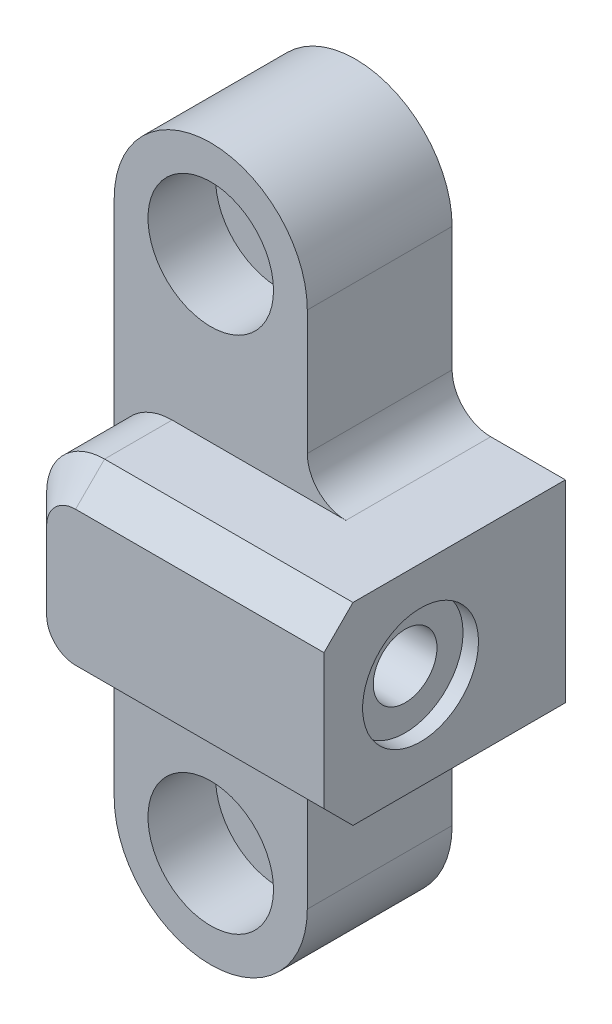
ISO-10303-21;
HEADER;
FILE_DESCRIPTION(('STEP AP214'),'2;1');
FILE_NAME('part.step','',(''),(''),'','','');
FILE_SCHEMA(('AUTOMOTIVE_DESIGN { 1 0 10303 214 1 1 1 1 }'));
ENDSEC;
DATA;
#1=APPLICATION_CONTEXT('core data for automotive mechanical design processes');
#2=APPLICATION_PROTOCOL_DEFINITION('international standard','automotive_design',2000,#1);
#3=PRODUCT_CONTEXT('',#1,'mechanical');
#4=PRODUCT('Part','Part','',(#3));
#5=PRODUCT_RELATED_PRODUCT_CATEGORY('part','',(#4));
#6=PRODUCT_DEFINITION_FORMATION('','',#4);
#7=PRODUCT_DEFINITION_CONTEXT('part definition',#1,'design');
#8=PRODUCT_DEFINITION('design','',#6,#7);
#9=PRODUCT_DEFINITION_SHAPE('','',#8);
#10=(LENGTH_UNIT() NAMED_UNIT(*) SI_UNIT(.MILLI.,.METRE.));
#11=(NAMED_UNIT(*) PLANE_ANGLE_UNIT() SI_UNIT($,.RADIAN.));
#12=(NAMED_UNIT(*) SI_UNIT($,.STERADIAN.) SOLID_ANGLE_UNIT());
#13=UNCERTAINTY_MEASURE_WITH_UNIT(LENGTH_MEASURE(1.E-05),#10,'distance_accuracy_value','');
#14=(GEOMETRIC_REPRESENTATION_CONTEXT(3) GLOBAL_UNCERTAINTY_ASSIGNED_CONTEXT((#13)) GLOBAL_UNIT_ASSIGNED_CONTEXT((#10,
#11,#12)) REPRESENTATION_CONTEXT('',''));
#15=CARTESIAN_POINT('',(0.,0.,0.));
#16=DIRECTION('',(0.,0.,1.));
#17=DIRECTION('',(1.,0.,0.));
#18=AXIS2_PLACEMENT_3D('',#15,#16,#17);
#19=CARTESIAN_POINT('',(24.300000000001,-5.,12.5));
#20=DIRECTION('',(1.,0.,0.));
#21=DIRECTION('',(0.,0.,-1.));
#22=AXIS2_PLACEMENT_3D('',#19,#20,#21);
#23=PLANE('',#22);
#24=CARTESIAN_POINT('',(24.300000000001,0.,7.5));
#25=DIRECTION('',(1.,0.,0.));
#26=DIRECTION('',(0.,0.,-1.));
#27=AXIS2_PLACEMENT_3D('',#24,#25,#26);
#28=CIRCLE('',#27,3.);
#29=CARTESIAN_POINT('',(24.300000000001,0.,4.5));
#30=VERTEX_POINT('',#29);
#31=EDGE_CURVE('E696',#30,#30,#28,.T.);
#32=ORIENTED_EDGE('',*,*,#31,.F.);
#33=EDGE_LOOP('',(#32));
#34=FACE_BOUND('',#33,.T.);
#35=DIRECTION('',(0.,0.,-1.));
#36=VECTOR('',#35,1.);
#37=CARTESIAN_POINT('',(24.300000000001,5.,12.5));
#38=LINE('',#37,#36);
#39=CARTESIAN_POINT('',(24.300000000001,5.,11.));
#40=VERTEX_POINT('',#39);
#41=CARTESIAN_POINT('',(24.300000000001,5.,0.));
#42=VERTEX_POINT('',#41);
#43=EDGE_CURVE('E220',#40,#42,#38,.T.);
#44=ORIENTED_EDGE('',*,*,#43,.F.);
#45=DIRECTION('',(0.,0.707106781186544,-0.707106781186551));
#46=VECTOR('',#45,1.);
#47=CARTESIAN_POINT('',(24.300000000001,-0.749999999999962,16.75));
#48=LINE('',#47,#46);
#49=CARTESIAN_POINT('',(24.300000000001,3.5,12.5));
#50=VERTEX_POINT('',#49);
#51=EDGE_CURVE('E259',#40,#50,#48,.F.);
#52=ORIENTED_EDGE('',*,*,#51,.T.);
#53=DIRECTION('',(0.,1.,0.));
#54=VECTOR('',#53,1.);
#55=CARTESIAN_POINT('',(24.300000000001,-5.,12.5));
#56=LINE('',#55,#54);
#57=CARTESIAN_POINT('',(24.300000000001,-3.50000000000001,12.5));
#58=VERTEX_POINT('',#57);
#59=EDGE_CURVE('E232',#58,#50,#56,.T.);
#60=ORIENTED_EDGE('',*,*,#59,.F.);
#61=DIRECTION('',(0.,-0.707106781186544,-0.707106781186551));
#62=VECTOR('',#61,1.);
#63=CARTESIAN_POINT('',(24.300000000001,-4.25,11.75));
#64=LINE('',#63,#62);
#65=CARTESIAN_POINT('',(24.300000000001,-5.,11.));
#66=VERTEX_POINT('',#65);
#67=EDGE_CURVE('E257',#58,#66,#64,.T.);
#68=ORIENTED_EDGE('',*,*,#67,.T.);
#69=DIRECTION('',(0.,0.,-1.));
#70=VECTOR('',#69,1.);
#71=CARTESIAN_POINT('',(24.300000000001,-5.,12.5));
#72=LINE('',#71,#70);
#73=CARTESIAN_POINT('',(24.300000000001,-5.,0.));
#74=VERTEX_POINT('',#73);
#75=EDGE_CURVE('E223',#66,#74,#72,.T.);
#76=ORIENTED_EDGE('',*,*,#75,.T.);
#77=DIRECTION('',(0.,1.,0.));
#78=VECTOR('',#77,1.);
#79=CARTESIAN_POINT('',(24.300000000001,-5.,0.));
#80=LINE('',#79,#78);
#81=EDGE_CURVE('E228',#74,#42,#80,.T.);
#82=ORIENTED_EDGE('',*,*,#81,.T.);
#83=EDGE_LOOP('',(#44,#52,#60,#68,#76,#82));
#84=FACE_BOUND('',#83,.T.);
#85=ADVANCED_FACE('F43',(#34,#84),#23,.T.);
#86=CARTESIAN_POINT('',(8.4350288425443,-5.,12.5));
#87=DIRECTION('',(0.,0.,1.));
#88=DIRECTION('',(1.,0.,0.));
#89=AXIS2_PLACEMENT_3D('',#86,#87,#88);
#90=PLANE('',#89);
#91=ORIENTED_EDGE('',*,*,#59,.T.);
#92=DIRECTION('',(-1.,0.,0.));
#93=VECTOR('',#92,1.);
#94=CARTESIAN_POINT('',(8.4350288425443,3.5,12.5));
#95=LINE('',#94,#93);
#96=CARTESIAN_POINT('',(11.4350288425443,3.5,12.5));
#97=VERTEX_POINT('',#96);
#98=EDGE_CURVE('E269',#50,#97,#95,.T.);
#99=ORIENTED_EDGE('',*,*,#98,.T.);
#100=CARTESIAN_POINT('',(11.4350288425443,2.,12.5));
#101=DIRECTION('',(0.,0.,1.));
#102=DIRECTION('',(1.,0.,0.));
#103=AXIS2_PLACEMENT_3D('',#100,#101,#102);
#104=CIRCLE('',#103,1.5);
#105=CARTESIAN_POINT('',(9.9350288425443,2.,12.5));
#106=VERTEX_POINT('',#105);
#107=EDGE_CURVE('E267',#97,#106,#104,.T.);
#108=ORIENTED_EDGE('',*,*,#107,.T.);
#109=DIRECTION('',(0.,-1.,0.));
#110=VECTOR('',#109,1.);
#111=CARTESIAN_POINT('',(9.9350288425443,-5.,12.5));
#112=LINE('',#111,#110);
#113=CARTESIAN_POINT('',(9.9350288425443,-2.,12.5));
#114=VERTEX_POINT('',#113);
#115=EDGE_CURVE('E265',#106,#114,#112,.T.);
#116=ORIENTED_EDGE('',*,*,#115,.T.);
#117=CARTESIAN_POINT('',(11.4350288425443,-2.,12.5));
#118=DIRECTION('',(0.,0.,1.));
#119=DIRECTION('',(1.,0.,0.));
#120=AXIS2_PLACEMENT_3D('',#117,#118,#119);
#121=CIRCLE('',#120,1.5);
#122=CARTESIAN_POINT('',(11.4350288425443,-3.50000000000001,12.5));
#123=VERTEX_POINT('',#122);
#124=EDGE_CURVE('E263',#114,#123,#121,.T.);
#125=ORIENTED_EDGE('',*,*,#124,.T.);
#126=DIRECTION('',(1.,0.,0.));
#127=VECTOR('',#126,1.);
#128=CARTESIAN_POINT('',(24.300000000001,-3.50000000000001,12.5));
#129=LINE('',#128,#127);
#130=EDGE_CURVE('E261',#123,#58,#129,.T.);
#131=ORIENTED_EDGE('',*,*,#130,.T.);
#132=EDGE_LOOP('',(#91,#99,#108,#116,#125,#131));
#133=FACE_BOUND('',#132,.T.);
#134=ADVANCED_FACE('F366',(#133),#90,.T.);
#135=CARTESIAN_POINT('',(8.4350288425443,-5.,0.));
#136=DIRECTION('',(-1.,0.,0.));
#137=DIRECTION('',(0.,0.,1.));
#138=AXIS2_PLACEMENT_3D('',#135,#136,#137);
#139=PLANE('',#138);
#140=DIRECTION('',(0.,0.,1.));
#141=VECTOR('',#140,1.);
#142=CARTESIAN_POINT('',(8.4350288425443,-2.,12.5));
#143=LINE('',#142,#141);
#144=CARTESIAN_POINT('',(8.4350288425443,-2.,7.5));
#145=VERTEX_POINT('',#144);
#146=CARTESIAN_POINT('',(8.4350288425443,-2.,11.));
#147=VERTEX_POINT('',#146);
#148=EDGE_CURVE('E241',#145,#147,#143,.T.);
#149=ORIENTED_EDGE('',*,*,#148,.T.);
#150=DIRECTION('',(0.,1.,0.));
#151=VECTOR('',#150,1.);
#152=CARTESIAN_POINT('',(8.4350288425443,-5.,11.));
#153=LINE('',#152,#151);
#154=CARTESIAN_POINT('',(8.4350288425443,2.,11.));
#155=VERTEX_POINT('',#154);
#156=EDGE_CURVE('E273',#147,#155,#153,.T.);
#157=ORIENTED_EDGE('',*,*,#156,.T.);
#158=DIRECTION('',(0.,0.,1.));
#159=VECTOR('',#158,1.);
#160=CARTESIAN_POINT('',(8.4350288425443,2.,0.));
#161=LINE('',#160,#159);
#162=CARTESIAN_POINT('',(8.4350288425443,2.,7.5));
#163=VERTEX_POINT('',#162);
#164=EDGE_CURVE('E235',#155,#163,#161,.F.);
#165=ORIENTED_EDGE('',*,*,#164,.T.);
#166=DIRECTION('',(0.,1.,0.));
#167=VECTOR('',#166,1.);
#168=CARTESIAN_POINT('',(8.4350288425443,5.,7.5));
#169=LINE('',#168,#167);
#170=CARTESIAN_POINT('',(8.4350288425443,13.4350288425445,7.5));
#171=VERTEX_POINT('',#170);
#172=EDGE_CURVE('E186',#163,#171,#169,.T.);
#173=ORIENTED_EDGE('',*,*,#172,.T.);
#174=DIRECTION('',(0.,0.,-1.));
#175=VECTOR('',#174,1.);
#176=CARTESIAN_POINT('',(8.4350288425443,13.4350288425445,7.5));
#177=LINE('',#176,#175);
#178=CARTESIAN_POINT('',(8.4350288425443,13.4350288425445,0.));
#179=VERTEX_POINT('',#178);
#180=EDGE_CURVE('E194',#171,#179,#177,.T.);
#181=ORIENTED_EDGE('',*,*,#180,.T.);
#182=DIRECTION('',(0.,1.,0.));
#183=VECTOR('',#182,1.);
#184=CARTESIAN_POINT('',(8.4350288425443,-5.,0.));
#185=LINE('',#184,#183);
#186=CARTESIAN_POINT('',(8.4350288425441,-13.4350288425443,0.));
#187=VERTEX_POINT('',#186);
#188=EDGE_CURVE('E236',#187,#179,#185,.T.);
#189=ORIENTED_EDGE('',*,*,#188,.F.);
#190=DIRECTION('',(0.,0.,-1.));
#191=VECTOR('',#190,1.);
#192=CARTESIAN_POINT('',(8.4350288425441,-13.4350288425443,7.5));
#193=LINE('',#192,#191);
#194=CARTESIAN_POINT('',(8.4350288425441,-13.4350288425443,7.5));
#195=VERTEX_POINT('',#194);
#196=EDGE_CURVE('E217',#195,#187,#193,.T.);
#197=ORIENTED_EDGE('',*,*,#196,.F.);
#198=DIRECTION('',(0.,1.,0.));
#199=VECTOR('',#198,1.);
#200=CARTESIAN_POINT('',(8.4350288425443,-13.4350288425443,7.5));
#201=LINE('',#200,#199);
#202=EDGE_CURVE('E203',#195,#145,#201,.T.);
#203=ORIENTED_EDGE('',*,*,#202,.T.);
#204=EDGE_LOOP('',(#149,#157,#165,#173,#181,#189,#197,#203));
#205=FACE_BOUND('',#204,.T.);
#206=ADVANCED_FACE('F345',(#205),#139,.T.);
#207=CARTESIAN_POINT('',(24.300000000001,-5.,0.));
#208=DIRECTION('',(0.,0.,-1.));
#209=DIRECTION('',(-1.,0.,0.));
#210=AXIS2_PLACEMENT_3D('',#207,#208,#209);
#211=PLANE('',#210);
#212=CARTESIAN_POINT('',(13.4350288425443,13.4350288425445,0.));
#213=DIRECTION('',(0.,0.,1.));
#214=DIRECTION('',(1.,0.,0.));
#215=AXIS2_PLACEMENT_3D('',#212,#213,#214);
#216=CIRCLE('',#215,1.70000000000001);
#217=CARTESIAN_POINT('',(15.1350288425443,13.4350288425445,0.));
#218=VERTEX_POINT('',#217);
#219=EDGE_CURVE('E681',#218,#218,#216,.T.);
#220=ORIENTED_EDGE('',*,*,#219,.T.);
#221=EDGE_LOOP('',(#220));
#222=FACE_BOUND('',#221,.T.);
#223=CARTESIAN_POINT('',(13.4350288425445,-13.4350288425443,0.));
#224=DIRECTION('',(0.,0.,1.));
#225=DIRECTION('',(1.,0.,0.));
#226=AXIS2_PLACEMENT_3D('',#223,#224,#225);
#227=CIRCLE('',#226,1.70000000000001);
#228=CARTESIAN_POINT('',(15.1350288425445,-13.4350288425443,0.));
#229=VERTEX_POINT('',#228);
#230=EDGE_CURVE('E693',#229,#229,#227,.T.);
#231=ORIENTED_EDGE('',*,*,#230,.T.);
#232=EDGE_LOOP('',(#231));
#233=FACE_BOUND('',#232,.T.);
#234=DIRECTION('',(-1.,0.,0.));
#235=VECTOR('',#234,1.);
#236=CARTESIAN_POINT('',(24.300000000001,5.,0.));
#237=LINE('',#236,#235);
#238=CARTESIAN_POINT('',(20.4350288425443,5.,0.));
#239=VERTEX_POINT('',#238);
#240=EDGE_CURVE('E226',#42,#239,#237,.T.);
#241=ORIENTED_EDGE('',*,*,#240,.F.);
#242=ORIENTED_EDGE('',*,*,#81,.F.);
#243=DIRECTION('',(-1.,0.,0.));
#244=VECTOR('',#243,1.);
#245=CARTESIAN_POINT('',(24.300000000001,-5.,0.));
#246=LINE('',#245,#244);
#247=CARTESIAN_POINT('',(20.4350288425443,-5.,0.));
#248=VERTEX_POINT('',#247);
#249=EDGE_CURVE('E225',#74,#248,#246,.T.);
#250=ORIENTED_EDGE('',*,*,#249,.T.);
#251=CARTESIAN_POINT('',(20.4350288425443,-7.,0.));
#252=DIRECTION('',(0.,0.,-1.));
#253=DIRECTION('',(-1.,0.,0.));
#254=AXIS2_PLACEMENT_3D('',#251,#252,#253);
#255=CIRCLE('',#254,2.);
#256=CARTESIAN_POINT('',(18.4350288425443,-7.00000000000005,0.));
#257=VERTEX_POINT('',#256);
#258=EDGE_CURVE('E51',#248,#257,#255,.F.);
#259=ORIENTED_EDGE('',*,*,#258,.T.);
#260=DIRECTION('',(0.,-1.,0.));
#261=VECTOR('',#260,1.);
#262=CARTESIAN_POINT('',(18.4350288425443,-5.,0.));
#263=LINE('',#262,#261);
#264=CARTESIAN_POINT('',(18.4350288425445,-13.4350288425443,0.));
#265=VERTEX_POINT('',#264);
#266=EDGE_CURVE('E200',#257,#265,#263,.T.);
#267=ORIENTED_EDGE('',*,*,#266,.T.);
#268=CARTESIAN_POINT('',(13.4350288425442,-13.4350288425443,0.));
#269=DIRECTION('',(0.,0.,-1.));
#270=DIRECTION('',(-1.,0.,0.));
#271=AXIS2_PLACEMENT_3D('',#268,#269,#270);
#272=CIRCLE('',#271,5.0000000000001);
#273=EDGE_CURVE('E206',#265,#187,#272,.T.);
#274=ORIENTED_EDGE('',*,*,#273,.T.);
#275=ORIENTED_EDGE('',*,*,#188,.T.);
#276=CARTESIAN_POINT('',(13.4350288425443,13.4350288425445,0.));
#277=DIRECTION('',(0.,0.,-1.));
#278=DIRECTION('',(-1.,0.,0.));
#279=AXIS2_PLACEMENT_3D('',#276,#277,#278);
#280=CIRCLE('',#279,5.);
#281=CARTESIAN_POINT('',(18.4350288425443,13.4350288425445,0.));
#282=VERTEX_POINT('',#281);
#283=EDGE_CURVE('E172',#179,#282,#280,.T.);
#284=ORIENTED_EDGE('',*,*,#283,.T.);
#285=DIRECTION('',(0.,-1.,0.));
#286=VECTOR('',#285,1.);
#287=CARTESIAN_POINT('',(18.4350288425443,13.4350288425445,0.));
#288=LINE('',#287,#286);
#289=CARTESIAN_POINT('',(18.4350288425443,7.,0.));
#290=VERTEX_POINT('',#289);
#291=EDGE_CURVE('E176',#282,#290,#288,.T.);
#292=ORIENTED_EDGE('',*,*,#291,.T.);
#293=CARTESIAN_POINT('',(20.4350288425443,7.,0.));
#294=DIRECTION('',(0.,0.,-1.));
#295=DIRECTION('',(-1.,0.,0.));
#296=AXIS2_PLACEMENT_3D('',#293,#294,#295);
#297=CIRCLE('',#296,2.);
#298=EDGE_CURVE('E302',#290,#239,#297,.F.);
#299=ORIENTED_EDGE('',*,*,#298,.T.);
#300=EDGE_LOOP('',(#241,#242,#250,#259,#267,#274,#275,#284,#292,#299));
#301=FACE_BOUND('',#300,.T.);
#302=ADVANCED_FACE('F317',(#222,#233,#301),#211,.T.);
#303=CARTESIAN_POINT('',(0.,-5.,0.));
#304=DIRECTION('',(0.,1.,0.));
#305=DIRECTION('',(0.,0.,1.));
#306=AXIS2_PLACEMENT_3D('',#303,#304,#305);
#307=PLANE('',#306);
#308=DIRECTION('',(1.,0.,0.));
#309=VECTOR('',#308,1.);
#310=CARTESIAN_POINT('',(8.4350288425443,-5.,7.5));
#311=LINE('',#310,#309);
#312=CARTESIAN_POINT('',(11.4350288425443,-5.,7.5));
#313=VERTEX_POINT('',#312);
#314=CARTESIAN_POINT('',(20.4350288425443,-5.,7.5));
#315=VERTEX_POINT('',#314);
#316=EDGE_CURVE('E205',#313,#315,#311,.T.);
#317=ORIENTED_EDGE('',*,*,#316,.T.);
#318=DIRECTION('',(0.,0.,-1.));
#319=VECTOR('',#318,1.);
#320=CARTESIAN_POINT('',(20.4350288425443,-5.,0.));
#321=LINE('',#320,#319);
#322=EDGE_CURVE('E298',#315,#248,#321,.T.);
#323=ORIENTED_EDGE('',*,*,#322,.T.);
#324=ORIENTED_EDGE('',*,*,#249,.F.);
#325=ORIENTED_EDGE('',*,*,#75,.F.);
#326=DIRECTION('',(-1.,0.,0.));
#327=VECTOR('',#326,1.);
#328=CARTESIAN_POINT('',(11.4350288425443,-5.,11.));
#329=LINE('',#328,#327);
#330=CARTESIAN_POINT('',(11.4350288425443,-5.,11.));
#331=VERTEX_POINT('',#330);
#332=EDGE_CURVE('E277',#66,#331,#329,.T.);
#333=ORIENTED_EDGE('',*,*,#332,.T.);
#334=DIRECTION('',(0.,0.,1.));
#335=VECTOR('',#334,1.);
#336=CARTESIAN_POINT('',(11.4350288425443,-5.,7.5));
#337=LINE('',#336,#335);
#338=EDGE_CURVE('E244',#331,#313,#337,.F.);
#339=ORIENTED_EDGE('',*,*,#338,.T.);
#340=EDGE_LOOP('',(#317,#323,#324,#325,#333,#339));
#341=FACE_BOUND('',#340,.T.);
#342=ADVANCED_FACE('F327',(#341),#307,.F.);
#343=CARTESIAN_POINT('',(0.,5.,0.));
#344=DIRECTION('',(0.,1.,0.));
#345=DIRECTION('',(0.,0.,1.));
#346=AXIS2_PLACEMENT_3D('',#343,#344,#345);
#347=PLANE('',#346);
#348=ORIENTED_EDGE('',*,*,#240,.T.);
#349=DIRECTION('',(0.,0.,-1.));
#350=VECTOR('',#349,1.);
#351=CARTESIAN_POINT('',(20.4350288425443,5.,7.5));
#352=LINE('',#351,#350);
#353=CARTESIAN_POINT('',(20.4350288425443,5.,7.5));
#354=VERTEX_POINT('',#353);
#355=EDGE_CURVE('E295',#239,#354,#352,.F.);
#356=ORIENTED_EDGE('',*,*,#355,.T.);
#357=DIRECTION('',(-1.,0.,0.));
#358=VECTOR('',#357,1.);
#359=CARTESIAN_POINT('',(18.4350288425443,5.,7.5));
#360=LINE('',#359,#358);
#361=CARTESIAN_POINT('',(11.4350288425443,5.,7.5));
#362=VERTEX_POINT('',#361);
#363=EDGE_CURVE('E183',#354,#362,#360,.T.);
#364=ORIENTED_EDGE('',*,*,#363,.T.);
#365=DIRECTION('',(0.,0.,1.));
#366=VECTOR('',#365,1.);
#367=CARTESIAN_POINT('',(11.4350288425443,5.,0.));
#368=LINE('',#367,#366);
#369=CARTESIAN_POINT('',(11.4350288425443,5.,11.));
#370=VERTEX_POINT('',#369);
#371=EDGE_CURVE('E246',#362,#370,#368,.T.);
#372=ORIENTED_EDGE('',*,*,#371,.T.);
#373=DIRECTION('',(1.,0.,0.));
#374=VECTOR('',#373,1.);
#375=CARTESIAN_POINT('',(0.,5.,11.));
#376=LINE('',#375,#374);
#377=EDGE_CURVE('E254',#370,#40,#376,.T.);
#378=ORIENTED_EDGE('',*,*,#377,.T.);
#379=ORIENTED_EDGE('',*,*,#43,.T.);
#380=EDGE_LOOP('',(#348,#356,#364,#372,#378,#379));
#381=FACE_BOUND('',#380,.T.);
#382=ADVANCED_FACE('F320',(#381),#347,.T.);
#383=CARTESIAN_POINT('',(13.4350288425442,-13.4350288425443,7.5));
#384=DIRECTION('',(0.,0.,-1.));
#385=DIRECTION('',(-1.,0.,0.));
#386=AXIS2_PLACEMENT_3D('',#383,#384,#385);
#387=CYLINDRICAL_SURFACE('',#386,5.0000000000001);
#388=ORIENTED_EDGE('',*,*,#273,.F.);
#389=DIRECTION('',(0.,0.,-1.));
#390=VECTOR('',#389,1.);
#391=CARTESIAN_POINT('',(18.4350288425445,-13.4350288425443,7.5));
#392=LINE('',#391,#390);
#393=CARTESIAN_POINT('',(18.4350288425445,-13.4350288425443,7.5));
#394=VERTEX_POINT('',#393);
#395=EDGE_CURVE('E213',#394,#265,#392,.T.);
#396=ORIENTED_EDGE('',*,*,#395,.F.);
#397=CARTESIAN_POINT('',(13.4350288425442,-13.4350288425443,7.5));
#398=DIRECTION('',(0.,0.,-1.));
#399=DIRECTION('',(-1.,0.,0.));
#400=AXIS2_PLACEMENT_3D('',#397,#398,#399);
#401=CIRCLE('',#400,5.0000000000001);
#402=EDGE_CURVE('E210',#394,#195,#401,.T.);
#403=ORIENTED_EDGE('',*,*,#402,.T.);
#404=ORIENTED_EDGE('',*,*,#196,.T.);
#405=EDGE_LOOP('',(#388,#396,#403,#404));
#406=FACE_BOUND('',#405,.T.);
#407=ADVANCED_FACE('F342',(#406),#387,.T.);
#408=CARTESIAN_POINT('',(18.4350288425443,-5.,7.5));
#409=DIRECTION('',(1.,0.,0.));
#410=DIRECTION('',(0.,1.,0.));
#411=AXIS2_PLACEMENT_3D('',#408,#409,#410);
#412=PLANE('',#411);
#413=ORIENTED_EDGE('',*,*,#266,.F.);
#414=DIRECTION('',(0.,0.,-1.));
#415=VECTOR('',#414,1.);
#416=CARTESIAN_POINT('',(18.4350288425443,-7.00000000000005,7.5));
#417=LINE('',#416,#415);
#418=CARTESIAN_POINT('',(18.4350288425443,-7.00000000000005,7.5));
#419=VERTEX_POINT('',#418);
#420=EDGE_CURVE('E58',#257,#419,#417,.F.);
#421=ORIENTED_EDGE('',*,*,#420,.T.);
#422=DIRECTION('',(0.,-1.,0.));
#423=VECTOR('',#422,1.);
#424=CARTESIAN_POINT('',(18.4350288425443,-5.,7.5));
#425=LINE('',#424,#423);
#426=EDGE_CURVE('E208',#419,#394,#425,.T.);
#427=ORIENTED_EDGE('',*,*,#426,.T.);
#428=ORIENTED_EDGE('',*,*,#395,.T.);
#429=EDGE_LOOP('',(#413,#421,#427,#428));
#430=FACE_BOUND('',#429,.T.);
#431=ADVANCED_FACE('F339',(#430),#412,.T.);
#432=CARTESIAN_POINT('',(13.4350288425442,-13.4350288425443,7.5));
#433=DIRECTION('',(0.,0.,-1.));
#434=DIRECTION('',(-1.,0.,0.));
#435=AXIS2_PLACEMENT_3D('',#432,#433,#434);
#436=PLANE('',#435);
#437=CARTESIAN_POINT('',(13.4350288425445,-13.4350288425443,7.5));
#438=DIRECTION('',(0.,0.,1.));
#439=DIRECTION('',(1.,0.,0.));
#440=AXIS2_PLACEMENT_3D('',#437,#438,#439);
#441=CIRCLE('',#440,3.24999999999999);
#442=CARTESIAN_POINT('',(16.6850288425445,-13.4350288425443,7.5));
#443=VERTEX_POINT('',#442);
#444=EDGE_CURVE('E678',#443,#443,#441,.T.);
#445=ORIENTED_EDGE('',*,*,#444,.F.);
#446=EDGE_LOOP('',(#445));
#447=FACE_BOUND('',#446,.T.);
#448=ORIENTED_EDGE('',*,*,#202,.F.);
#449=ORIENTED_EDGE('',*,*,#402,.F.);
#450=ORIENTED_EDGE('',*,*,#426,.F.);
#451=CARTESIAN_POINT('',(20.4350288425443,-7.,7.5));
#452=DIRECTION('',(0.,0.,-1.));
#453=DIRECTION('',(-1.,0.,0.));
#454=AXIS2_PLACEMENT_3D('',#451,#452,#453);
#455=CIRCLE('',#454,2.);
#456=EDGE_CURVE('E11',#419,#315,#455,.T.);
#457=ORIENTED_EDGE('',*,*,#456,.T.);
#458=ORIENTED_EDGE('',*,*,#316,.F.);
#459=CARTESIAN_POINT('',(11.4350288425443,-2.,7.5));
#460=DIRECTION('',(0.,0.,-1.));
#461=DIRECTION('',(-1.,0.,0.));
#462=AXIS2_PLACEMENT_3D('',#459,#460,#461);
#463=CIRCLE('',#462,3.);
#464=EDGE_CURVE('E249',#313,#145,#463,.T.);
#465=ORIENTED_EDGE('',*,*,#464,.T.);
#466=EDGE_LOOP('',(#448,#449,#450,#457,#458,#465));
#467=FACE_BOUND('',#466,.T.);
#468=ADVANCED_FACE('F335',(#447,#467),#436,.F.);
#469=CARTESIAN_POINT('',(18.4350288425443,13.4350288425445,7.5));
#470=DIRECTION('',(1.,0.,0.));
#471=DIRECTION('',(0.,0.,-1.));
#472=AXIS2_PLACEMENT_3D('',#469,#470,#471);
#473=PLANE('',#472);
#474=DIRECTION('',(0.,-1.,0.));
#475=VECTOR('',#474,1.);
#476=CARTESIAN_POINT('',(18.4350288425443,13.4350288425445,7.5));
#477=LINE('',#476,#475);
#478=CARTESIAN_POINT('',(18.4350288425443,13.4350288425445,7.5));
#479=VERTEX_POINT('',#478);
#480=CARTESIAN_POINT('',(18.4350288425443,7.,7.5));
#481=VERTEX_POINT('',#480);
#482=EDGE_CURVE('E192',#479,#481,#477,.T.);
#483=ORIENTED_EDGE('',*,*,#482,.T.);
#484=DIRECTION('',(0.,0.,-1.));
#485=VECTOR('',#484,1.);
#486=CARTESIAN_POINT('',(18.4350288425443,7.,0.));
#487=LINE('',#486,#485);
#488=EDGE_CURVE('E279',#481,#290,#487,.T.);
#489=ORIENTED_EDGE('',*,*,#488,.T.);
#490=ORIENTED_EDGE('',*,*,#291,.F.);
#491=DIRECTION('',(0.,0.,-1.));
#492=VECTOR('',#491,1.);
#493=CARTESIAN_POINT('',(18.4350288425443,13.4350288425445,7.5));
#494=LINE('',#493,#492);
#495=EDGE_CURVE('E198',#479,#282,#494,.T.);
#496=ORIENTED_EDGE('',*,*,#495,.F.);
#497=EDGE_LOOP('',(#483,#489,#490,#496));
#498=FACE_BOUND('',#497,.T.);
#499=ADVANCED_FACE('F313',(#498),#473,.T.);
#500=CARTESIAN_POINT('',(13.4350288425443,13.4350288425445,7.5));
#501=DIRECTION('',(0.,0.,-1.));
#502=DIRECTION('',(-1.,0.,0.));
#503=AXIS2_PLACEMENT_3D('',#500,#501,#502);
#504=CYLINDRICAL_SURFACE('',#503,5.);
#505=ORIENTED_EDGE('',*,*,#283,.F.);
#506=ORIENTED_EDGE('',*,*,#180,.F.);
#507=CARTESIAN_POINT('',(13.4350288425443,13.4350288425445,7.5));
#508=DIRECTION('',(0.,0.,-1.));
#509=DIRECTION('',(-1.,0.,0.));
#510=AXIS2_PLACEMENT_3D('',#507,#508,#509);
#511=CIRCLE('',#510,5.);
#512=EDGE_CURVE('E189',#171,#479,#511,.T.);
#513=ORIENTED_EDGE('',*,*,#512,.T.);
#514=ORIENTED_EDGE('',*,*,#495,.T.);
#515=EDGE_LOOP('',(#505,#506,#513,#514));
#516=FACE_BOUND('',#515,.T.);
#517=ADVANCED_FACE('F348',(#516),#504,.T.);
#518=CARTESIAN_POINT('',(13.4350288425443,13.4350288425445,7.5));
#519=DIRECTION('',(0.,0.,-1.));
#520=DIRECTION('',(-1.,0.,0.));
#521=AXIS2_PLACEMENT_3D('',#518,#519,#520);
#522=PLANE('',#521);
#523=CARTESIAN_POINT('',(13.4350288425443,13.4350288425445,7.5));
#524=DIRECTION('',(0.,0.,1.));
#525=DIRECTION('',(1.,0.,0.));
#526=AXIS2_PLACEMENT_3D('',#523,#524,#525);
#527=CIRCLE('',#526,3.24999999999999);
#528=CARTESIAN_POINT('',(16.6850288425443,13.4350288425445,7.5));
#529=VERTEX_POINT('',#528);
#530=EDGE_CURVE('E292',#529,#529,#527,.T.);
#531=ORIENTED_EDGE('',*,*,#530,.F.);
#532=EDGE_LOOP('',(#531));
#533=FACE_BOUND('',#532,.T.);
#534=ORIENTED_EDGE('',*,*,#363,.F.);
#535=CARTESIAN_POINT('',(20.4350288425443,7.,7.5));
#536=DIRECTION('',(0.,0.,-1.));
#537=DIRECTION('',(-1.,0.,0.));
#538=AXIS2_PLACEMENT_3D('',#535,#536,#537);
#539=CIRCLE('',#538,2.);
#540=EDGE_CURVE('E304',#354,#481,#539,.T.);
#541=ORIENTED_EDGE('',*,*,#540,.T.);
#542=ORIENTED_EDGE('',*,*,#482,.F.);
#543=ORIENTED_EDGE('',*,*,#512,.F.);
#544=ORIENTED_EDGE('',*,*,#172,.F.);
#545=CARTESIAN_POINT('',(11.4350288425443,2.,7.5));
#546=DIRECTION('',(0.,0.,-1.));
#547=DIRECTION('',(-1.,0.,0.));
#548=AXIS2_PLACEMENT_3D('',#545,#546,#547);
#549=CIRCLE('',#548,3.);
#550=EDGE_CURVE('E252',#163,#362,#549,.T.);
#551=ORIENTED_EDGE('',*,*,#550,.T.);
#552=EDGE_LOOP('',(#534,#541,#542,#543,#544,#551));
#553=FACE_BOUND('',#552,.T.);
#554=ADVANCED_FACE('F166',(#533,#553),#522,.F.);
#555=CARTESIAN_POINT('',(14.500000000001,0.,7.5));
#556=DIRECTION('',(1.,0.,0.));
#557=DIRECTION('',(0.,0.,-1.));
#558=AXIS2_PLACEMENT_3D('',#555,#556,#557);
#559=CONICAL_SURFACE('',#558,1.65,1.02974425867665);
#560=CARTESIAN_POINT('',(13.5085799786055,0.,7.5));
#561=VERTEX_POINT('',#560);
#562=VERTEX_LOOP('',#561);
#563=FACE_BOUND('',#562,.T.);
#564=CARTESIAN_POINT('',(14.500000000001,0.,7.5));
#565=DIRECTION('',(1.,0.,0.));
#566=DIRECTION('',(0.,0.,-1.));
#567=AXIS2_PLACEMENT_3D('',#564,#565,#566);
#568=CIRCLE('',#567,1.65);
#569=CARTESIAN_POINT('',(14.500000000001,0.,5.85));
#570=VERTEX_POINT('',#569);
#571=EDGE_CURVE('E170',#570,#570,#568,.T.);
#572=ORIENTED_EDGE('',*,*,#571,.T.);
#573=EDGE_LOOP('',(#572));
#574=FACE_BOUND('',#573,.T.);
#575=ADVANCED_FACE('F162',(#563,#574),#559,.F.);
#576=CARTESIAN_POINT('',(24.300000000001,0.,7.5));
#577=DIRECTION('',(1.,0.,0.));
#578=DIRECTION('',(0.,0.,-1.));
#579=AXIS2_PLACEMENT_3D('',#576,#577,#578);
#580=CYLINDRICAL_SURFACE('',#579,1.65);
#581=ORIENTED_EDGE('',*,*,#571,.F.);
#582=EDGE_LOOP('',(#581));
#583=FACE_BOUND('',#582,.T.);
#584=CARTESIAN_POINT('',(23.500000000001,0.,7.5));
#585=DIRECTION('',(1.,0.,0.));
#586=DIRECTION('',(0.,0.,-1.));
#587=AXIS2_PLACEMENT_3D('',#584,#585,#586);
#588=CIRCLE('',#587,1.65);
#589=CARTESIAN_POINT('',(23.500000000001,0.,5.85));
#590=VERTEX_POINT('',#589);
#591=EDGE_CURVE('E173',#590,#590,#588,.T.);
#592=ORIENTED_EDGE('',*,*,#591,.T.);
#593=EDGE_LOOP('',(#592));
#594=FACE_BOUND('',#593,.T.);
#595=ADVANCED_FACE('F165',(#583,#594),#580,.F.);
#596=CARTESIAN_POINT('',(23.500000000001,1.65,7.5));
#597=DIRECTION('',(-1.,0.,0.));
#598=DIRECTION('',(0.,0.,1.));
#599=AXIS2_PLACEMENT_3D('',#596,#597,#598);
#600=PLANE('',#599);
#601=ORIENTED_EDGE('',*,*,#591,.F.);
#602=EDGE_LOOP('',(#601));
#603=FACE_BOUND('',#602,.T.);
#604=CARTESIAN_POINT('',(23.500000000001,0.,7.5));
#605=DIRECTION('',(1.,0.,0.));
#606=DIRECTION('',(0.,0.,-1.));
#607=AXIS2_PLACEMENT_3D('',#604,#605,#606);
#608=CIRCLE('',#607,3.);
#609=CARTESIAN_POINT('',(23.500000000001,0.,4.5));
#610=VERTEX_POINT('',#609);
#611=EDGE_CURVE('E179',#610,#610,#608,.T.);
#612=ORIENTED_EDGE('',*,*,#611,.T.);
#613=EDGE_LOOP('',(#612));
#614=FACE_BOUND('',#613,.T.);
#615=ADVANCED_FACE('F549',(#603,#614),#600,.F.);
#616=CARTESIAN_POINT('',(24.300000000001,0.,7.5));
#617=DIRECTION('',(1.,0.,0.));
#618=DIRECTION('',(0.,0.,-1.));
#619=AXIS2_PLACEMENT_3D('',#616,#617,#618);
#620=CYLINDRICAL_SURFACE('',#619,3.);
#621=ORIENTED_EDGE('',*,*,#611,.F.);
#622=EDGE_LOOP('',(#621));
#623=FACE_BOUND('',#622,.T.);
#624=ORIENTED_EDGE('',*,*,#31,.T.);
#625=EDGE_LOOP('',(#624));
#626=FACE_BOUND('',#625,.T.);
#627=ADVANCED_FACE('F539',(#623,#626),#620,.F.);
#628=CARTESIAN_POINT('',(13.4350288425445,-13.4350288425443,7.5));
#629=DIRECTION('',(0.,0.,1.));
#630=DIRECTION('',(1.,0.,0.));
#631=AXIS2_PLACEMENT_3D('',#628,#629,#630);
#632=CYLINDRICAL_SURFACE('',#631,1.70000000000001);
#633=ORIENTED_EDGE('',*,*,#230,.F.);
#634=EDGE_LOOP('',(#633));
#635=FACE_BOUND('',#634,.T.);
#636=CARTESIAN_POINT('',(13.4350288425445,-13.4350288425443,4.));
#637=DIRECTION('',(0.,0.,1.));
#638=DIRECTION('',(1.,0.,0.));
#639=AXIS2_PLACEMENT_3D('',#636,#637,#638);
#640=CIRCLE('',#639,1.70000000000001);
#641=CARTESIAN_POINT('',(15.1350288425445,-13.4350288425443,4.));
#642=VERTEX_POINT('',#641);
#643=EDGE_CURVE('E684',#642,#642,#640,.T.);
#644=ORIENTED_EDGE('',*,*,#643,.T.);
#645=EDGE_LOOP('',(#644));
#646=FACE_BOUND('',#645,.T.);
#647=ADVANCED_FACE('F529',(#635,#646),#632,.F.);
#648=CARTESIAN_POINT('',(15.1350288425445,-13.4350288425443,4.));
#649=DIRECTION('',(0.,0.,-1.));
#650=DIRECTION('',(-1.,0.,0.));
#651=AXIS2_PLACEMENT_3D('',#648,#649,#650);
#652=PLANE('',#651);
#653=ORIENTED_EDGE('',*,*,#643,.F.);
#654=EDGE_LOOP('',(#653));
#655=FACE_BOUND('',#654,.T.);
#656=CARTESIAN_POINT('',(13.4350288425445,-13.4350288425443,4.));
#657=DIRECTION('',(0.,0.,1.));
#658=DIRECTION('',(1.,0.,0.));
#659=AXIS2_PLACEMENT_3D('',#656,#657,#658);
#660=CIRCLE('',#659,3.24999999999999);
#661=CARTESIAN_POINT('',(16.6850288425445,-13.4350288425443,4.));
#662=VERTEX_POINT('',#661);
#663=EDGE_CURVE('E680',#662,#662,#660,.T.);
#664=ORIENTED_EDGE('',*,*,#663,.T.);
#665=EDGE_LOOP('',(#664));
#666=FACE_BOUND('',#665,.T.);
#667=ADVANCED_FACE('F519',(#655,#666),#652,.F.);
#668=CARTESIAN_POINT('',(13.4350288425445,-13.4350288425443,7.5));
#669=DIRECTION('',(0.,0.,1.));
#670=DIRECTION('',(1.,0.,0.));
#671=AXIS2_PLACEMENT_3D('',#668,#669,#670);
#672=CYLINDRICAL_SURFACE('',#671,3.24999999999999);
#673=ORIENTED_EDGE('',*,*,#663,.F.);
#674=EDGE_LOOP('',(#673));
#675=FACE_BOUND('',#674,.T.);
#676=ORIENTED_EDGE('',*,*,#444,.T.);
#677=EDGE_LOOP('',(#676));
#678=FACE_BOUND('',#677,.T.);
#679=ADVANCED_FACE('F509',(#675,#678),#672,.F.);
#680=CARTESIAN_POINT('',(13.4350288425443,13.4350288425445,7.5));
#681=DIRECTION('',(0.,0.,1.));
#682=DIRECTION('',(1.,0.,0.));
#683=AXIS2_PLACEMENT_3D('',#680,#681,#682);
#684=CYLINDRICAL_SURFACE('',#683,1.70000000000001);
#685=ORIENTED_EDGE('',*,*,#219,.F.);
#686=EDGE_LOOP('',(#685));
#687=FACE_BOUND('',#686,.T.);
#688=CARTESIAN_POINT('',(13.4350288425443,13.4350288425445,4.));
#689=DIRECTION('',(0.,0.,1.));
#690=DIRECTION('',(1.,0.,0.));
#691=AXIS2_PLACEMENT_3D('',#688,#689,#690);
#692=CIRCLE('',#691,1.70000000000001);
#693=CARTESIAN_POINT('',(15.1350288425443,13.4350288425445,4.));
#694=VERTEX_POINT('',#693);
#695=EDGE_CURVE('E687',#694,#694,#692,.T.);
#696=ORIENTED_EDGE('',*,*,#695,.T.);
#697=EDGE_LOOP('',(#696));
#698=FACE_BOUND('',#697,.T.);
#699=ADVANCED_FACE('F499',(#687,#698),#684,.F.);
#700=CARTESIAN_POINT('',(15.1350288425443,13.4350288425445,4.));
#701=DIRECTION('',(0.,0.,-1.));
#702=DIRECTION('',(-1.,0.,0.));
#703=AXIS2_PLACEMENT_3D('',#700,#701,#702);
#704=PLANE('',#703);
#705=ORIENTED_EDGE('',*,*,#695,.F.);
#706=EDGE_LOOP('',(#705));
#707=FACE_BOUND('',#706,.T.);
#708=CARTESIAN_POINT('',(13.4350288425443,13.4350288425445,4.));
#709=DIRECTION('',(0.,0.,1.));
#710=DIRECTION('',(1.,0.,0.));
#711=AXIS2_PLACEMENT_3D('',#708,#709,#710);
#712=CIRCLE('',#711,3.24999999999999);
#713=CARTESIAN_POINT('',(16.6850288425443,13.4350288425445,4.));
#714=VERTEX_POINT('',#713);
#715=EDGE_CURVE('E710',#714,#714,#712,.T.);
#716=ORIENTED_EDGE('',*,*,#715,.T.);
#717=EDGE_LOOP('',(#716));
#718=FACE_BOUND('',#717,.T.);
#719=ADVANCED_FACE('F489',(#707,#718),#704,.F.);
#720=CARTESIAN_POINT('',(13.4350288425443,13.4350288425445,7.5));
#721=DIRECTION('',(0.,0.,1.));
#722=DIRECTION('',(1.,0.,0.));
#723=AXIS2_PLACEMENT_3D('',#720,#721,#722);
#724=CYLINDRICAL_SURFACE('',#723,3.24999999999999);
#725=ORIENTED_EDGE('',*,*,#715,.F.);
#726=EDGE_LOOP('',(#725));
#727=FACE_BOUND('',#726,.T.);
#728=ORIENTED_EDGE('',*,*,#530,.T.);
#729=EDGE_LOOP('',(#728));
#730=FACE_BOUND('',#729,.T.);
#731=ADVANCED_FACE('F407',(#727,#730),#724,.F.);
#732=CARTESIAN_POINT('',(11.4350288425443,-2.,0.));
#733=DIRECTION('',(0.,0.,-1.));
#734=DIRECTION('',(-1.,0.,0.));
#735=AXIS2_PLACEMENT_3D('',#732,#733,#734);
#736=CYLINDRICAL_SURFACE('',#735,3.);
#737=ORIENTED_EDGE('',*,*,#338,.F.);
#738=CARTESIAN_POINT('',(11.4350288425443,-2.,11.));
#739=DIRECTION('',(0.,0.,1.));
#740=DIRECTION('',(1.,0.,0.));
#741=AXIS2_PLACEMENT_3D('',#738,#739,#740);
#742=CIRCLE('',#741,3.);
#743=EDGE_CURVE('E275',#331,#147,#742,.F.);
#744=ORIENTED_EDGE('',*,*,#743,.T.);
#745=ORIENTED_EDGE('',*,*,#148,.F.);
#746=ORIENTED_EDGE('',*,*,#464,.F.);
#747=EDGE_LOOP('',(#737,#744,#745,#746));
#748=FACE_BOUND('',#747,.T.);
#749=ADVANCED_FACE('F380',(#748),#736,.T.);
#750=CARTESIAN_POINT('',(11.4350288425443,2.,0.));
#751=DIRECTION('',(0.,0.,1.));
#752=DIRECTION('',(1.,0.,0.));
#753=AXIS2_PLACEMENT_3D('',#750,#751,#752);
#754=CYLINDRICAL_SURFACE('',#753,3.);
#755=ORIENTED_EDGE('',*,*,#164,.F.);
#756=CARTESIAN_POINT('',(11.4350288425443,2.,11.));
#757=DIRECTION('',(0.,0.,1.));
#758=DIRECTION('',(1.,0.,0.));
#759=AXIS2_PLACEMENT_3D('',#756,#757,#758);
#760=CIRCLE('',#759,3.);
#761=EDGE_CURVE('E271',#155,#370,#760,.F.);
#762=ORIENTED_EDGE('',*,*,#761,.T.);
#763=ORIENTED_EDGE('',*,*,#371,.F.);
#764=ORIENTED_EDGE('',*,*,#550,.F.);
#765=EDGE_LOOP('',(#755,#762,#763,#764));
#766=FACE_BOUND('',#765,.T.);
#767=ADVANCED_FACE('F353',(#766),#754,.T.);
#768=CARTESIAN_POINT('',(8.4350288425443,-3.50000000000001,12.5));
#769=DIRECTION('',(0.,-0.707106781186551,0.707106781186544));
#770=DIRECTION('',(-1.,0.,0.));
#771=AXIS2_PLACEMENT_3D('',#768,#769,#770);
#772=PLANE('',#771);
#773=ORIENTED_EDGE('',*,*,#67,.F.);
#774=ORIENTED_EDGE('',*,*,#130,.F.);
#775=DIRECTION('',(0.,0.707106781186544,0.707106781186551));
#776=VECTOR('',#775,1.);
#777=CARTESIAN_POINT('',(11.4350288425443,-5.,11.));
#778=LINE('',#777,#776);
#779=EDGE_CURVE('E289',#331,#123,#778,.T.);
#780=ORIENTED_EDGE('',*,*,#779,.F.);
#781=ORIENTED_EDGE('',*,*,#332,.F.);
#782=EDGE_LOOP('',(#773,#774,#780,#781));
#783=FACE_BOUND('',#782,.T.);
#784=ADVANCED_FACE('F371',(#783),#772,.T.);
#785=CARTESIAN_POINT('',(11.4350288425443,-2.,12.5));
#786=DIRECTION('',(0.,0.,-1.));
#787=DIRECTION('',(-1.,0.,0.));
#788=AXIS2_PLACEMENT_3D('',#785,#786,#787);
#789=CONICAL_SURFACE('',#788,1.5,0.785398163397444);
#790=ORIENTED_EDGE('',*,*,#779,.T.);
#791=ORIENTED_EDGE('',*,*,#124,.F.);
#792=DIRECTION('',(0.707106781186544,0.,0.707106781186551));
#793=VECTOR('',#792,1.);
#794=CARTESIAN_POINT('',(8.4350288425443,-2.,11.));
#795=LINE('',#794,#793);
#796=EDGE_CURVE('E286',#147,#114,#795,.T.);
#797=ORIENTED_EDGE('',*,*,#796,.F.);
#798=ORIENTED_EDGE('',*,*,#743,.F.);
#799=EDGE_LOOP('',(#790,#791,#797,#798));
#800=FACE_BOUND('',#799,.T.);
#801=ADVANCED_FACE('F374',(#800),#789,.T.);
#802=CARTESIAN_POINT('',(8.4350288425443,-5.,11.));
#803=DIRECTION('',(0.707106781186551,0.,-0.707106781186544));
#804=DIRECTION('',(0.,1.,0.));
#805=AXIS2_PLACEMENT_3D('',#802,#803,#804);
#806=PLANE('',#805);
#807=ORIENTED_EDGE('',*,*,#796,.T.);
#808=ORIENTED_EDGE('',*,*,#115,.F.);
#809=DIRECTION('',(0.707106781186544,0.,0.707106781186551));
#810=VECTOR('',#809,1.);
#811=CARTESIAN_POINT('',(8.4350288425443,2.,11.));
#812=LINE('',#811,#810);
#813=EDGE_CURVE('E283',#155,#106,#812,.T.);
#814=ORIENTED_EDGE('',*,*,#813,.F.);
#815=ORIENTED_EDGE('',*,*,#156,.F.);
#816=EDGE_LOOP('',(#807,#808,#814,#815));
#817=FACE_BOUND('',#816,.T.);
#818=ADVANCED_FACE('F382',(#817),#806,.F.);
#819=CARTESIAN_POINT('',(11.4350288425443,2.,12.5));
#820=DIRECTION('',(0.,0.,-1.));
#821=DIRECTION('',(-1.,0.,0.));
#822=AXIS2_PLACEMENT_3D('',#819,#820,#821);
#823=CONICAL_SURFACE('',#822,1.5,0.785398163397444);
#824=ORIENTED_EDGE('',*,*,#813,.T.);
#825=ORIENTED_EDGE('',*,*,#107,.F.);
#826=DIRECTION('',(0.,-0.707106781186544,0.707106781186551));
#827=VECTOR('',#826,1.);
#828=CARTESIAN_POINT('',(11.4350288425443,5.,11.));
#829=LINE('',#828,#827);
#830=EDGE_CURVE('E280',#370,#97,#829,.T.);
#831=ORIENTED_EDGE('',*,*,#830,.F.);
#832=ORIENTED_EDGE('',*,*,#761,.F.);
#833=EDGE_LOOP('',(#824,#825,#831,#832));
#834=FACE_BOUND('',#833,.T.);
#835=ADVANCED_FACE('F359',(#834),#823,.T.);
#836=CARTESIAN_POINT('',(0.,5.,11.));
#837=DIRECTION('',(0.,-0.707106781186551,-0.707106781186544));
#838=DIRECTION('',(1.,0.,0.));
#839=AXIS2_PLACEMENT_3D('',#836,#837,#838);
#840=PLANE('',#839);
#841=ORIENTED_EDGE('',*,*,#830,.T.);
#842=ORIENTED_EDGE('',*,*,#98,.F.);
#843=ORIENTED_EDGE('',*,*,#51,.F.);
#844=ORIENTED_EDGE('',*,*,#377,.F.);
#845=EDGE_LOOP('',(#841,#842,#843,#844));
#846=FACE_BOUND('',#845,.T.);
#847=ADVANCED_FACE('F362',(#846),#840,.F.);
#848=CARTESIAN_POINT('',(20.4350288425443,7.,7.5));
#849=DIRECTION('',(0.,0.,1.));
#850=DIRECTION('',(1.,0.,0.));
#851=AXIS2_PLACEMENT_3D('',#848,#849,#850);
#852=CYLINDRICAL_SURFACE('',#851,2.);
#853=ORIENTED_EDGE('',*,*,#540,.F.);
#854=ORIENTED_EDGE('',*,*,#355,.F.);
#855=ORIENTED_EDGE('',*,*,#298,.F.);
#856=ORIENTED_EDGE('',*,*,#488,.F.);
#857=EDGE_LOOP('',(#853,#854,#855,#856));
#858=FACE_BOUND('',#857,.T.);
#859=ADVANCED_FACE('F315',(#858),#852,.F.);
#860=CARTESIAN_POINT('',(20.4350288425443,-7.,0.));
#861=DIRECTION('',(0.,0.,-1.));
#862=DIRECTION('',(-1.,0.,0.));
#863=AXIS2_PLACEMENT_3D('',#860,#861,#862);
#864=CYLINDRICAL_SURFACE('',#863,2.);
#865=ORIENTED_EDGE('',*,*,#456,.F.);
#866=ORIENTED_EDGE('',*,*,#420,.F.);
#867=ORIENTED_EDGE('',*,*,#258,.F.);
#868=ORIENTED_EDGE('',*,*,#322,.F.);
#869=EDGE_LOOP('',(#865,#866,#867,#868));
#870=FACE_BOUND('',#869,.T.);
#871=ADVANCED_FACE('F45',(#870),#864,.F.);
#872=CLOSED_SHELL('',(#85,#134,#206,#302,#342,#382,#407,#431,#468,#499,#517,#554,#575,#595,#615,
#627,#647,#667,#679,#699,#719,#731,#749,#767,#784,#801,#818,#835,#847,#859,#871));
#873=MANIFOLD_SOLID_BREP('B2',#872);
#874=ADVANCED_BREP_SHAPE_REPRESENTATION('',(#18,#873),#14);
#875=SHAPE_DEFINITION_REPRESENTATION(#9,#874);
ENDSEC;
END-ISO-10303-21;
